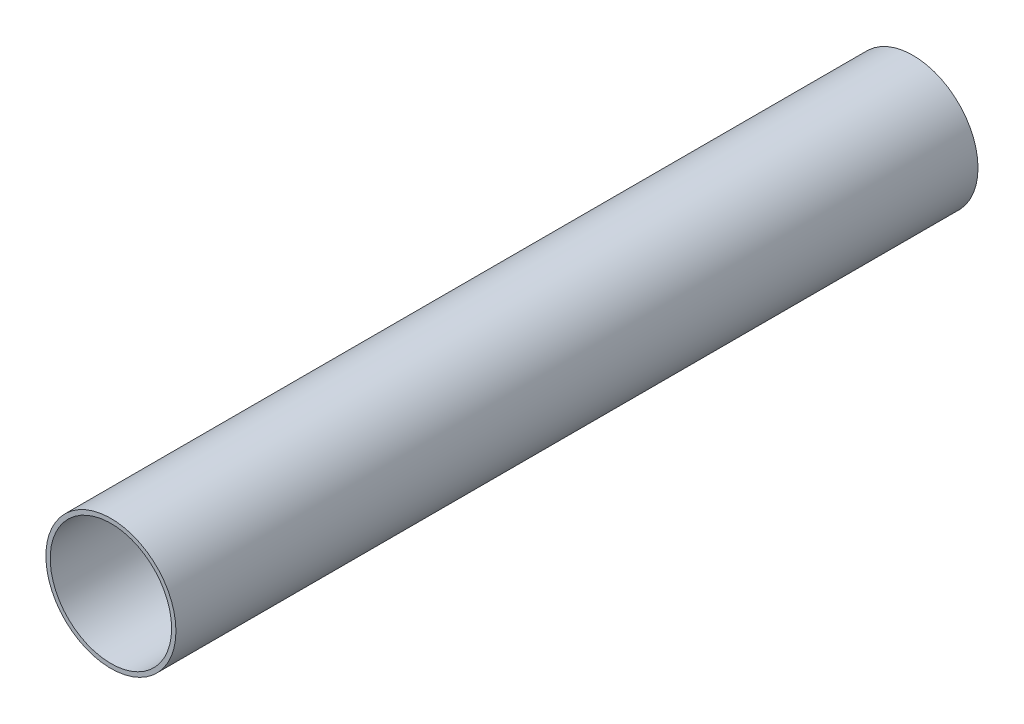
ISO-10303-21;
HEADER;
FILE_DESCRIPTION(('STEP AP214'),'2;1');
FILE_NAME('part.step','',(''),(''),'','','');
FILE_SCHEMA(('AUTOMOTIVE_DESIGN { 1 0 10303 214 1 1 1 1 }'));
ENDSEC;
DATA;
#1=APPLICATION_CONTEXT('core data for automotive mechanical design processes');
#2=APPLICATION_PROTOCOL_DEFINITION('international standard','automotive_design',2000,#1);
#3=PRODUCT_CONTEXT('',#1,'mechanical');
#4=PRODUCT('Part','Part','',(#3));
#5=PRODUCT_RELATED_PRODUCT_CATEGORY('part','',(#4));
#6=PRODUCT_DEFINITION_FORMATION('','',#4);
#7=PRODUCT_DEFINITION_CONTEXT('part definition',#1,'design');
#8=PRODUCT_DEFINITION('design','',#6,#7);
#9=PRODUCT_DEFINITION_SHAPE('','',#8);
#10=(LENGTH_UNIT() NAMED_UNIT(*) SI_UNIT(.MILLI.,.METRE.));
#11=(NAMED_UNIT(*) PLANE_ANGLE_UNIT() SI_UNIT($,.RADIAN.));
#12=(NAMED_UNIT(*) SI_UNIT($,.STERADIAN.) SOLID_ANGLE_UNIT());
#13=UNCERTAINTY_MEASURE_WITH_UNIT(LENGTH_MEASURE(1.E-05),#10,'distance_accuracy_value','');
#14=(GEOMETRIC_REPRESENTATION_CONTEXT(3) GLOBAL_UNCERTAINTY_ASSIGNED_CONTEXT((#13)) GLOBAL_UNIT_ASSIGNED_CONTEXT((#10,
#11,#12)) REPRESENTATION_CONTEXT('',''));
#15=CARTESIAN_POINT('',(0.,0.,0.));
#16=DIRECTION('',(0.,0.,1.));
#17=DIRECTION('',(1.,0.,0.));
#18=AXIS2_PLACEMENT_3D('',#15,#16,#17);
#19=CARTESIAN_POINT('',(0.,0.,185.));
#20=DIRECTION('',(0.,0.,1.));
#21=DIRECTION('',(1.,0.,0.));
#22=AXIS2_PLACEMENT_3D('',#19,#20,#21);
#23=PLANE('',#22);
#24=CARTESIAN_POINT('',(0.,0.,185.));
#25=DIRECTION('',(0.,0.,1.));
#26=DIRECTION('',(1.,0.,0.));
#27=AXIS2_PLACEMENT_3D('',#24,#25,#26);
#28=CIRCLE('',#27,15.);
#29=CARTESIAN_POINT('',(15.,0.,185.));
#30=VERTEX_POINT('',#29);
#31=EDGE_CURVE('E10',#30,#30,#28,.T.);
#32=ORIENTED_EDGE('',*,*,#31,.T.);
#33=EDGE_LOOP('',(#32));
#34=FACE_BOUND('',#33,.T.);
#35=CARTESIAN_POINT('',(0.,0.,185.));
#36=DIRECTION('',(0.,0.,1.));
#37=DIRECTION('',(1.,0.,0.));
#38=AXIS2_PLACEMENT_3D('',#35,#36,#37);
#39=CIRCLE('',#38,14.);
#40=CARTESIAN_POINT('',(14.,0.,185.));
#41=VERTEX_POINT('',#40);
#42=EDGE_CURVE('E57',#41,#41,#39,.T.);
#43=ORIENTED_EDGE('',*,*,#42,.F.);
#44=EDGE_LOOP('',(#43));
#45=FACE_BOUND('',#44,.T.);
#46=ADVANCED_FACE('F43',(#34,#45),#23,.T.);
#47=CARTESIAN_POINT('',(0.,0.,0.));
#48=DIRECTION('',(0.,0.,1.));
#49=DIRECTION('',(1.,0.,0.));
#50=AXIS2_PLACEMENT_3D('',#47,#48,#49);
#51=PLANE('',#50);
#52=CARTESIAN_POINT('',(0.,0.,0.));
#53=DIRECTION('',(0.,0.,1.));
#54=DIRECTION('',(1.,0.,0.));
#55=AXIS2_PLACEMENT_3D('',#52,#53,#54);
#56=CIRCLE('',#55,15.);
#57=CARTESIAN_POINT('',(15.,0.,0.));
#58=VERTEX_POINT('',#57);
#59=EDGE_CURVE('E48',#58,#58,#56,.T.);
#60=ORIENTED_EDGE('',*,*,#59,.F.);
#61=EDGE_LOOP('',(#60));
#62=FACE_BOUND('',#61,.T.);
#63=CARTESIAN_POINT('',(0.,0.,0.));
#64=DIRECTION('',(0.,0.,1.));
#65=DIRECTION('',(1.,0.,0.));
#66=AXIS2_PLACEMENT_3D('',#63,#64,#65);
#67=CIRCLE('',#66,14.);
#68=CARTESIAN_POINT('',(14.,0.,0.));
#69=VERTEX_POINT('',#68);
#70=EDGE_CURVE('E59',#69,#69,#67,.T.);
#71=ORIENTED_EDGE('',*,*,#70,.T.);
#72=EDGE_LOOP('',(#71));
#73=FACE_BOUND('',#72,.T.);
#74=ADVANCED_FACE('F71',(#62,#73),#51,.F.);
#75=CARTESIAN_POINT('',(0.,0.,185.));
#76=DIRECTION('',(0.,0.,-1.));
#77=DIRECTION('',(-1.,0.,0.));
#78=AXIS2_PLACEMENT_3D('',#75,#76,#77);
#79=CYLINDRICAL_SURFACE('',#78,15.);
#80=ORIENTED_EDGE('',*,*,#31,.F.);
#81=EDGE_LOOP('',(#80));
#82=FACE_BOUND('',#81,.T.);
#83=ORIENTED_EDGE('',*,*,#59,.T.);
#84=EDGE_LOOP('',(#83));
#85=FACE_BOUND('',#84,.T.);
#86=ADVANCED_FACE('F46',(#82,#85),#79,.T.);
#87=CARTESIAN_POINT('',(0.,0.,185.));
#88=DIRECTION('',(0.,0.,-1.));
#89=DIRECTION('',(-1.,0.,0.));
#90=AXIS2_PLACEMENT_3D('',#87,#88,#89);
#91=CYLINDRICAL_SURFACE('',#90,14.);
#92=ORIENTED_EDGE('',*,*,#42,.T.);
#93=EDGE_LOOP('',(#92));
#94=FACE_BOUND('',#93,.T.);
#95=ORIENTED_EDGE('',*,*,#70,.F.);
#96=EDGE_LOOP('',(#95));
#97=FACE_BOUND('',#96,.T.);
#98=ADVANCED_FACE('F67',(#94,#97),#91,.F.);
#99=CLOSED_SHELL('',(#46,#74,#86,#98));
#100=MANIFOLD_SOLID_BREP('B2',#99);
#101=ADVANCED_BREP_SHAPE_REPRESENTATION('',(#18,#100),#14);
#102=SHAPE_DEFINITION_REPRESENTATION(#9,#101);
ENDSEC;
END-ISO-10303-21;
